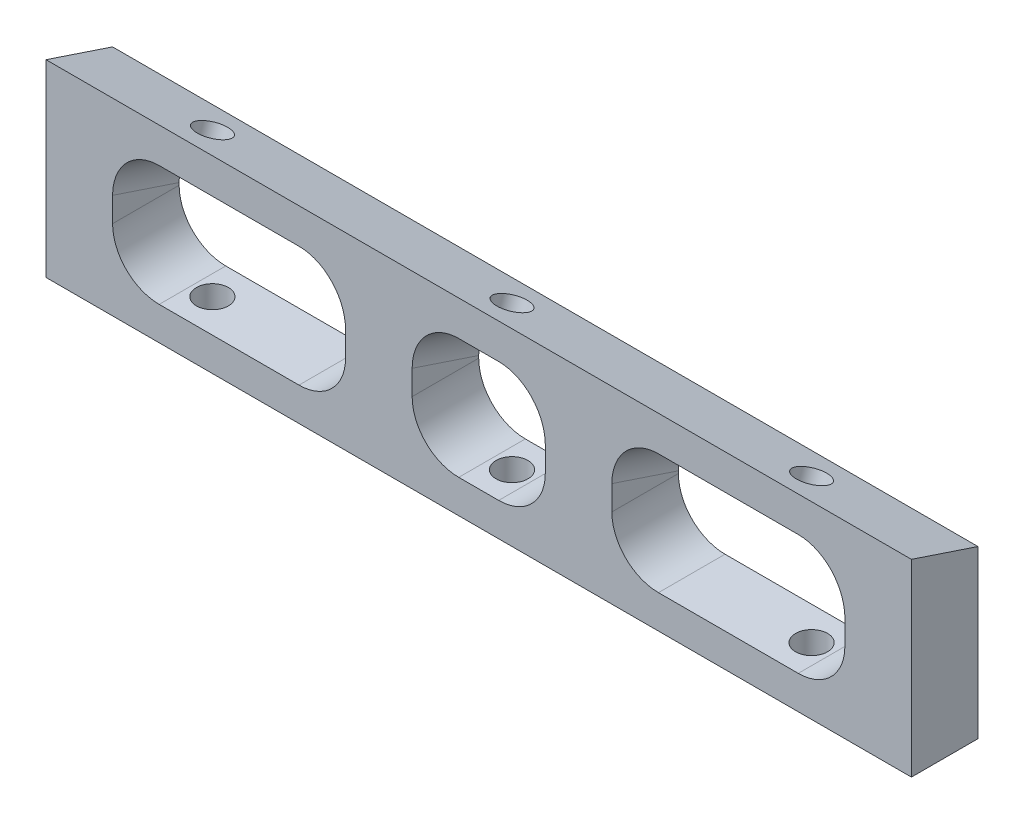
ISO-10303-21;
HEADER;
FILE_DESCRIPTION(('STEP AP214'),'2;1');
FILE_NAME('part.step','',(''),(''),'','','');
FILE_SCHEMA(('AUTOMOTIVE_DESIGN { 1 0 10303 214 1 1 1 1 }'));
ENDSEC;
DATA;
#1=APPLICATION_CONTEXT('core data for automotive mechanical design processes');
#2=APPLICATION_PROTOCOL_DEFINITION('international standard','automotive_design',2000,#1);
#3=PRODUCT_CONTEXT('',#1,'mechanical');
#4=PRODUCT('Part','Part','',(#3));
#5=PRODUCT_RELATED_PRODUCT_CATEGORY('part','',(#4));
#6=PRODUCT_DEFINITION_FORMATION('','',#4);
#7=PRODUCT_DEFINITION_CONTEXT('part definition',#1,'design');
#8=PRODUCT_DEFINITION('design','',#6,#7);
#9=PRODUCT_DEFINITION_SHAPE('','',#8);
#10=(LENGTH_UNIT() NAMED_UNIT(*) SI_UNIT(.MILLI.,.METRE.));
#11=(NAMED_UNIT(*) PLANE_ANGLE_UNIT() SI_UNIT($,.RADIAN.));
#12=(NAMED_UNIT(*) SI_UNIT($,.STERADIAN.) SOLID_ANGLE_UNIT());
#13=UNCERTAINTY_MEASURE_WITH_UNIT(LENGTH_MEASURE(1.E-05),#10,'distance_accuracy_value','');
#14=(GEOMETRIC_REPRESENTATION_CONTEXT(3) GLOBAL_UNCERTAINTY_ASSIGNED_CONTEXT((#13)) GLOBAL_UNIT_ASSIGNED_CONTEXT((#10,
#11,#12)) REPRESENTATION_CONTEXT('',''));
#15=CARTESIAN_POINT('',(0.,0.,0.));
#16=DIRECTION('',(0.,0.,1.));
#17=DIRECTION('',(1.,0.,0.));
#18=AXIS2_PLACEMENT_3D('',#15,#16,#17);
#19=CARTESIAN_POINT('',(110.,-1.74424407145593,0.581247299708271));
#20=DIRECTION('',(0.,0.948710608132916,-0.316145823973799));
#21=DIRECTION('',(0.,0.316145823973799,0.948710608132916));
#22=AXIS2_PLACEMENT_3D('',#19,#20,#21);
#23=PLANE('',#22);
#24=CARTESIAN_POINT('',(100.,-3.07736621159569,-3.419270880131));
#25=DIRECTION('',(0.,0.948710608132916,-0.316145823973799));
#26=DIRECTION('',(0.,0.316145823973799,0.948710608132916));
#27=AXIS2_PLACEMENT_3D('',#24,#25,#26);
#28=CIRCLE('',#27,2.4);
#29=CARTESIAN_POINT('',(100.,-2.31861623405858,-1.142365420612));
#30=VERTEX_POINT('',#29);
#31=EDGE_CURVE('E331',#30,#30,#28,.T.);
#32=ORIENTED_EDGE('',*,*,#31,.T.);
#33=EDGE_LOOP('',(#32));
#34=FACE_BOUND('',#33,.T.);
#35=DIRECTION('',(-1.,0.,0.));
#36=VECTOR('',#35,1.);
#37=CARTESIAN_POINT('',(110.,-1.93793739049709,0.));
#38=LINE('',#37,#36);
#39=CARTESIAN_POINT('',(103.,-1.93793739049709,0.));
#40=VERTEX_POINT('',#39);
#41=CARTESIAN_POINT('',(82.,-1.93793739049709,0.));
#42=VERTEX_POINT('',#41);
#43=EDGE_CURVE('E318',#40,#42,#38,.T.);
#44=ORIENTED_EDGE('',*,*,#43,.T.);
#45=DIRECTION('',(0.,-0.316145823973799,-0.948710608132916));
#46=VECTOR('',#45,1.);
#47=CARTESIAN_POINT('',(82.,-1.74424407145593,0.581247299708276));
#48=LINE('',#47,#46);
#49=CARTESIAN_POINT('',(82.,-5.27031104863485,-10.));
#50=VERTEX_POINT('',#49);
#51=EDGE_CURVE('E418',#42,#50,#48,.T.);
#52=ORIENTED_EDGE('',*,*,#51,.T.);
#53=DIRECTION('',(-1.,0.,0.));
#54=VECTOR('',#53,1.);
#55=CARTESIAN_POINT('',(110.,-5.27031104863485,-10.));
#56=LINE('',#55,#54);
#57=CARTESIAN_POINT('',(103.,-5.27031104863485,-10.));
#58=VERTEX_POINT('',#57);
#59=EDGE_CURVE('E313',#58,#50,#56,.T.);
#60=ORIENTED_EDGE('',*,*,#59,.F.);
#61=DIRECTION('',(0.,-0.316145823973799,-0.948710608132916));
#62=VECTOR('',#61,1.);
#63=CARTESIAN_POINT('',(103.,-1.93793739049709,0.));
#64=LINE('',#63,#62);
#65=EDGE_CURVE('E415',#58,#40,#64,.F.);
#66=ORIENTED_EDGE('',*,*,#65,.T.);
#67=EDGE_LOOP('',(#44,#52,#60,#66));
#68=FACE_BOUND('',#67,.T.);
#69=ADVANCED_FACE('F45',(#34,#68),#23,.F.);
#70=CARTESIAN_POINT('',(110.,-20.,0.));
#71=DIRECTION('',(0.,1.,0.));
#72=DIRECTION('',(0.,0.,1.));
#73=AXIS2_PLACEMENT_3D('',#70,#71,#72);
#74=PLANE('',#73);
#75=CARTESIAN_POINT('',(100.,-20.,-5.00000000000002));
#76=DIRECTION('',(0.,1.,0.));
#77=DIRECTION('',(0.,0.,1.));
#78=AXIS2_PLACEMENT_3D('',#75,#76,#77);
#79=CIRCLE('',#78,2.4);
#80=CARTESIAN_POINT('',(100.,-20.,-2.60000000000002));
#81=VERTEX_POINT('',#80);
#82=EDGE_CURVE('E337',#81,#81,#79,.T.);
#83=ORIENTED_EDGE('',*,*,#82,.F.);
#84=EDGE_LOOP('',(#83));
#85=FACE_BOUND('',#84,.T.);
#86=DIRECTION('',(-1.,0.,0.));
#87=VECTOR('',#86,1.);
#88=CARTESIAN_POINT('',(110.,-20.,-10.));
#89=LINE('',#88,#87);
#90=CARTESIAN_POINT('',(103.,-20.,-10.));
#91=VERTEX_POINT('',#90);
#92=CARTESIAN_POINT('',(82.,-20.,-10.));
#93=VERTEX_POINT('',#92);
#94=EDGE_CURVE('E276',#91,#93,#89,.T.);
#95=ORIENTED_EDGE('',*,*,#94,.T.);
#96=DIRECTION('',(0.,0.,-1.));
#97=VECTOR('',#96,1.);
#98=CARTESIAN_POINT('',(82.,-20.,0.));
#99=LINE('',#98,#97);
#100=CARTESIAN_POINT('',(82.,-20.,0.));
#101=VERTEX_POINT('',#100);
#102=EDGE_CURVE('E405',#93,#101,#99,.F.);
#103=ORIENTED_EDGE('',*,*,#102,.T.);
#104=DIRECTION('',(-1.,0.,0.));
#105=VECTOR('',#104,1.);
#106=CARTESIAN_POINT('',(110.,-20.,0.));
#107=LINE('',#106,#105);
#108=CARTESIAN_POINT('',(103.,-20.,0.));
#109=VERTEX_POINT('',#108);
#110=EDGE_CURVE('E282',#109,#101,#107,.T.);
#111=ORIENTED_EDGE('',*,*,#110,.F.);
#112=DIRECTION('',(0.,0.,-1.));
#113=VECTOR('',#112,1.);
#114=CARTESIAN_POINT('',(103.,-20.,0.));
#115=LINE('',#114,#113);
#116=EDGE_CURVE('E401',#109,#91,#115,.T.);
#117=ORIENTED_EDGE('',*,*,#116,.T.);
#118=EDGE_LOOP('',(#95,#103,#111,#117));
#119=FACE_BOUND('',#118,.T.);
#120=ADVANCED_FACE('F571',(#85,#119),#74,.T.);
#121=CARTESIAN_POINT('',(55.,-3.07736621159569,-3.419270880131));
#122=DIRECTION('',(0.,0.948710608132916,-0.316145823973799));
#123=DIRECTION('',(0.,0.316145823973799,0.948710608132916));
#124=AXIS2_PLACEMENT_3D('',#121,#122,#123);
#125=CIRCLE('',#124,2.4);
#126=CARTESIAN_POINT('',(55.,-2.31861623405858,-1.142365420612));
#127=VERTEX_POINT('',#126);
#128=EDGE_CURVE('E686',#127,#127,#125,.T.);
#129=ORIENTED_EDGE('',*,*,#128,.T.);
#130=EDGE_LOOP('',(#129));
#131=FACE_BOUND('',#130,.T.);
#132=CARTESIAN_POINT('',(58.,-1.93793739049709,0.));
#133=VERTEX_POINT('',#132);
#134=CARTESIAN_POINT('',(52.,-1.93793739049709,0.));
#135=VERTEX_POINT('',#134);
#136=EDGE_CURVE('E323',#133,#135,#38,.T.);
#137=ORIENTED_EDGE('',*,*,#136,.T.);
#138=DIRECTION('',(0.,-0.316145823973799,-0.948710608132916));
#139=VECTOR('',#138,1.);
#140=CARTESIAN_POINT('',(52.,-1.74424407145593,0.581247299708271));
#141=LINE('',#140,#139);
#142=CARTESIAN_POINT('',(52.,-5.27031104863485,-10.));
#143=VERTEX_POINT('',#142);
#144=EDGE_CURVE('E390',#135,#143,#141,.T.);
#145=ORIENTED_EDGE('',*,*,#144,.T.);
#146=CARTESIAN_POINT('',(58.,-5.27031104863485,-10.));
#147=VERTEX_POINT('',#146);
#148=EDGE_CURVE('E317',#147,#143,#56,.T.);
#149=ORIENTED_EDGE('',*,*,#148,.F.);
#150=DIRECTION('',(0.,0.316145823973799,0.948710608132916));
#151=VECTOR('',#150,1.);
#152=CARTESIAN_POINT('',(58.,-1.74424407145593,0.581247299708271));
#153=LINE('',#152,#151);
#154=EDGE_CURVE('E386',#147,#133,#153,.T.);
#155=ORIENTED_EDGE('',*,*,#154,.T.);
#156=EDGE_LOOP('',(#137,#145,#149,#155));
#157=FACE_BOUND('',#156,.T.);
#158=ADVANCED_FACE('F574',(#131,#157),#23,.F.);
#159=CARTESIAN_POINT('',(55.,-20.,-5.00000000000002));
#160=DIRECTION('',(0.,1.,0.));
#161=DIRECTION('',(0.,0.,1.));
#162=AXIS2_PLACEMENT_3D('',#159,#160,#161);
#163=CIRCLE('',#162,2.4);
#164=CARTESIAN_POINT('',(55.,-20.,-2.60000000000002));
#165=VERTEX_POINT('',#164);
#166=EDGE_CURVE('E670',#165,#165,#163,.T.);
#167=ORIENTED_EDGE('',*,*,#166,.F.);
#168=EDGE_LOOP('',(#167));
#169=FACE_BOUND('',#168,.T.);
#170=CARTESIAN_POINT('',(58.,-20.,-10.));
#171=VERTEX_POINT('',#170);
#172=CARTESIAN_POINT('',(52.,-20.,-10.));
#173=VERTEX_POINT('',#172);
#174=EDGE_CURVE('E281',#171,#173,#89,.T.);
#175=ORIENTED_EDGE('',*,*,#174,.T.);
#176=DIRECTION('',(0.,0.,-1.));
#177=VECTOR('',#176,1.);
#178=CARTESIAN_POINT('',(52.,-20.,0.));
#179=LINE('',#178,#177);
#180=CARTESIAN_POINT('',(52.,-20.,0.));
#181=VERTEX_POINT('',#180);
#182=EDGE_CURVE('E348',#173,#181,#179,.F.);
#183=ORIENTED_EDGE('',*,*,#182,.T.);
#184=CARTESIAN_POINT('',(58.,-20.,0.));
#185=VERTEX_POINT('',#184);
#186=EDGE_CURVE('E287',#185,#181,#107,.T.);
#187=ORIENTED_EDGE('',*,*,#186,.F.);
#188=DIRECTION('',(0.,0.,1.));
#189=VECTOR('',#188,1.);
#190=CARTESIAN_POINT('',(58.,-20.,-10.));
#191=LINE('',#190,#189);
#192=EDGE_CURVE('E345',#185,#171,#191,.F.);
#193=ORIENTED_EDGE('',*,*,#192,.T.);
#194=EDGE_LOOP('',(#175,#183,#187,#193));
#195=FACE_BOUND('',#194,.T.);
#196=ADVANCED_FACE('F580',(#169,#195),#74,.T.);
#197=CARTESIAN_POINT('',(110.,2.99930896920865,-0.999481820160727));
#198=DIRECTION('',(0.,-0.948710608132916,0.3161458239738));
#199=DIRECTION('',(0.,-0.3161458239738,-0.948710608132916));
#200=AXIS2_PLACEMENT_3D('',#197,#198,#199);
#201=PLANE('',#200);
#202=CARTESIAN_POINT('',(10.,1.66618682906889,-5.));
#203=DIRECTION('',(0.,0.948710608132916,-0.3161458239738));
#204=DIRECTION('',(0.,0.3161458239738,0.948710608132916));
#205=AXIS2_PLACEMENT_3D('',#202,#203,#204);
#206=CIRCLE('',#205,2.4);
#207=CARTESIAN_POINT('',(10.,2.42493680660601,-2.723094540481));
#208=VERTEX_POINT('',#207);
#209=EDGE_CURVE('E332',#208,#208,#206,.T.);
#210=ORIENTED_EDGE('',*,*,#209,.F.);
#211=EDGE_LOOP('',(#210));
#212=FACE_BOUND('',#211,.T.);
#213=CARTESIAN_POINT('',(55.,1.66618682906889,-5.));
#214=DIRECTION('',(0.,0.948710608132916,-0.3161458239738));
#215=DIRECTION('',(0.,0.3161458239738,0.948710608132916));
#216=AXIS2_PLACEMENT_3D('',#213,#214,#215);
#217=CIRCLE('',#216,2.4);
#218=CARTESIAN_POINT('',(55.,2.42493680660601,-2.723094540481));
#219=VERTEX_POINT('',#218);
#220=EDGE_CURVE('E677',#219,#219,#217,.T.);
#221=ORIENTED_EDGE('',*,*,#220,.F.);
#222=EDGE_LOOP('',(#221));
#223=FACE_BOUND('',#222,.T.);
#224=CARTESIAN_POINT('',(100.,1.66618682906889,-5.));
#225=DIRECTION('',(0.,0.948710608132916,-0.3161458239738));
#226=DIRECTION('',(0.,0.3161458239738,0.948710608132916));
#227=AXIS2_PLACEMENT_3D('',#224,#225,#226);
#228=CIRCLE('',#227,2.4);
#229=CARTESIAN_POINT('',(100.,2.42493680660601,-2.723094540481));
#230=VERTEX_POINT('',#229);
#231=EDGE_CURVE('E674',#230,#230,#228,.T.);
#232=ORIENTED_EDGE('',*,*,#231,.F.);
#233=EDGE_LOOP('',(#232));
#234=FACE_BOUND('',#233,.T.);
#235=DIRECTION('',(-1.,0.,0.));
#236=VECTOR('',#235,1.);
#237=CARTESIAN_POINT('',(110.,0.,-10.));
#238=LINE('',#237,#236);
#239=CARTESIAN_POINT('',(120.,0.,-10.));
#240=VERTEX_POINT('',#239);
#241=CARTESIAN_POINT('',(-10.,0.,-10.));
#242=VERTEX_POINT('',#241);
#243=EDGE_CURVE('E309',#240,#242,#238,.T.);
#244=ORIENTED_EDGE('',*,*,#243,.T.);
#245=DIRECTION('',(0.,-0.3161458239738,-0.948710608132916));
#246=VECTOR('',#245,1.);
#247=CARTESIAN_POINT('',(-10.,2.99930896920865,-0.999481820160727));
#248=LINE('',#247,#246);
#249=CARTESIAN_POINT('',(-10.,3.33237365813777,0.));
#250=VERTEX_POINT('',#249);
#251=EDGE_CURVE('E288',#250,#242,#248,.T.);
#252=ORIENTED_EDGE('',*,*,#251,.F.);
#253=DIRECTION('',(-1.,0.,0.));
#254=VECTOR('',#253,1.);
#255=CARTESIAN_POINT('',(110.,3.33237365813777,0.));
#256=LINE('',#255,#254);
#257=CARTESIAN_POINT('',(120.,3.33237365813777,0.));
#258=VERTEX_POINT('',#257);
#259=EDGE_CURVE('E322',#258,#250,#256,.T.);
#260=ORIENTED_EDGE('',*,*,#259,.F.);
#261=DIRECTION('',(0.,0.3161458239738,0.948710608132916));
#262=VECTOR('',#261,1.);
#263=CARTESIAN_POINT('',(120.,2.99930896920865,-0.999481820160727));
#264=LINE('',#263,#262);
#265=EDGE_CURVE('E252',#240,#258,#264,.T.);
#266=ORIENTED_EDGE('',*,*,#265,.F.);
#267=EDGE_LOOP('',(#244,#252,#260,#266));
#268=FACE_BOUND('',#267,.T.);
#269=ADVANCED_FACE('F594',(#212,#223,#234,#268),#201,.F.);
#270=CARTESIAN_POINT('',(110.,0.,0.));
#271=DIRECTION('',(0.,0.,-1.));
#272=DIRECTION('',(0.,1.,0.));
#273=AXIS2_PLACEMENT_3D('',#270,#271,#272);
#274=PLANE('',#273);
#275=ORIENTED_EDGE('',*,*,#136,.F.);
#276=CARTESIAN_POINT('',(58.,-9.31637285858588,0.));
#277=DIRECTION('',(0.,0.,-1.));
#278=DIRECTION('',(0.,1.,0.));
#279=AXIS2_PLACEMENT_3D('',#276,#277,#278);
#280=ELLIPSE('',#279,7.37843546808879,7.);
#281=CARTESIAN_POINT('',(65.,-9.31637285858588,0.));
#282=VERTEX_POINT('',#281);
#283=EDGE_CURVE('E463',#133,#282,#280,.T.);
#284=ORIENTED_EDGE('',*,*,#283,.T.);
#285=DIRECTION('',(0.,1.,0.));
#286=VECTOR('',#285,1.);
#287=CARTESIAN_POINT('',(65.,0.,0.));
#288=LINE('',#287,#286);
#289=CARTESIAN_POINT('',(65.,-13.,0.));
#290=VERTEX_POINT('',#289);
#291=EDGE_CURVE('E690',#290,#282,#288,.T.);
#292=ORIENTED_EDGE('',*,*,#291,.F.);
#293=CARTESIAN_POINT('',(58.,-13.,0.));
#294=DIRECTION('',(0.,0.,-1.));
#295=DIRECTION('',(0.,1.,0.));
#296=AXIS2_PLACEMENT_3D('',#293,#294,#295);
#297=CIRCLE('',#296,7.);
#298=EDGE_CURVE('E433',#290,#185,#297,.T.);
#299=ORIENTED_EDGE('',*,*,#298,.T.);
#300=ORIENTED_EDGE('',*,*,#186,.T.);
#301=CARTESIAN_POINT('',(52.,-13.,0.));
#302=DIRECTION('',(0.,0.,-1.));
#303=DIRECTION('',(0.,1.,0.));
#304=AXIS2_PLACEMENT_3D('',#301,#302,#303);
#305=CIRCLE('',#304,7.);
#306=CARTESIAN_POINT('',(45.,-13.,0.));
#307=VERTEX_POINT('',#306);
#308=EDGE_CURVE('E424',#181,#307,#305,.T.);
#309=ORIENTED_EDGE('',*,*,#308,.T.);
#310=DIRECTION('',(0.,-1.,0.));
#311=VECTOR('',#310,1.);
#312=CARTESIAN_POINT('',(45.,0.,0.));
#313=LINE('',#312,#311);
#314=CARTESIAN_POINT('',(45.,-9.31637285858588,0.));
#315=VERTEX_POINT('',#314);
#316=EDGE_CURVE('E540',#315,#307,#313,.T.);
#317=ORIENTED_EDGE('',*,*,#316,.F.);
#318=CARTESIAN_POINT('',(52.,-9.31637285858588,0.));
#319=DIRECTION('',(0.,0.,-1.));
#320=DIRECTION('',(0.,-1.,0.));
#321=AXIS2_PLACEMENT_3D('',#318,#319,#320);
#322=ELLIPSE('',#321,7.37843546808879,7.);
#323=EDGE_CURVE('E460',#315,#135,#322,.T.);
#324=ORIENTED_EDGE('',*,*,#323,.T.);
#325=EDGE_LOOP('',(#275,#284,#292,#299,#300,#309,#317,#324));
#326=FACE_BOUND('',#325,.T.);
#327=DIRECTION('',(0.,-1.,0.));
#328=VECTOR('',#327,1.);
#329=CARTESIAN_POINT('',(75.,0.,0.));
#330=LINE('',#329,#328);
#331=CARTESIAN_POINT('',(75.,-9.31637285858588,0.));
#332=VERTEX_POINT('',#331);
#333=CARTESIAN_POINT('',(75.,-13.,0.));
#334=VERTEX_POINT('',#333);
#335=EDGE_CURVE('E695',#332,#334,#330,.T.);
#336=ORIENTED_EDGE('',*,*,#335,.F.);
#337=CARTESIAN_POINT('',(82.,-9.31637285858588,0.));
#338=DIRECTION('',(0.,0.,-1.));
#339=DIRECTION('',(0.,-1.,0.));
#340=AXIS2_PLACEMENT_3D('',#337,#338,#339);
#341=ELLIPSE('',#340,7.37843546808879,7.);
#342=EDGE_CURVE('E483',#332,#42,#341,.T.);
#343=ORIENTED_EDGE('',*,*,#342,.T.);
#344=ORIENTED_EDGE('',*,*,#43,.F.);
#345=CARTESIAN_POINT('',(103.,-9.31637285858588,0.));
#346=DIRECTION('',(0.,0.,-1.));
#347=DIRECTION('',(0.,1.,0.));
#348=AXIS2_PLACEMENT_3D('',#345,#346,#347);
#349=ELLIPSE('',#348,7.37843546808879,7.);
#350=CARTESIAN_POINT('',(110.,-9.31637285858588,0.));
#351=VERTEX_POINT('',#350);
#352=EDGE_CURVE('E11',#40,#351,#349,.T.);
#353=ORIENTED_EDGE('',*,*,#352,.T.);
#354=DIRECTION('',(0.,-1.,0.));
#355=VECTOR('',#354,1.);
#356=CARTESIAN_POINT('',(110.,0.,0.));
#357=LINE('',#356,#355);
#358=CARTESIAN_POINT('',(110.,-13.,0.));
#359=VERTEX_POINT('',#358);
#360=EDGE_CURVE('E269',#351,#359,#357,.T.);
#361=ORIENTED_EDGE('',*,*,#360,.T.);
#362=CARTESIAN_POINT('',(103.,-13.,0.));
#363=DIRECTION('',(0.,0.,-1.));
#364=DIRECTION('',(0.,1.,0.));
#365=AXIS2_PLACEMENT_3D('',#362,#363,#364);
#366=CIRCLE('',#365,7.);
#367=EDGE_CURVE('E478',#359,#109,#366,.T.);
#368=ORIENTED_EDGE('',*,*,#367,.T.);
#369=ORIENTED_EDGE('',*,*,#110,.T.);
#370=CARTESIAN_POINT('',(82.,-13.,0.));
#371=DIRECTION('',(0.,0.,-1.));
#372=DIRECTION('',(0.,1.,0.));
#373=AXIS2_PLACEMENT_3D('',#370,#371,#372);
#374=CIRCLE('',#373,7.);
#375=EDGE_CURVE('E472',#101,#334,#374,.T.);
#376=ORIENTED_EDGE('',*,*,#375,.T.);
#377=EDGE_LOOP('',(#336,#343,#344,#353,#361,#368,#369,#376));
#378=FACE_BOUND('',#377,.T.);
#379=DIRECTION('',(1.,0.,0.));
#380=VECTOR('',#379,1.);
#381=CARTESIAN_POINT('',(-10.,-25.,0.));
#382=LINE('',#381,#380);
#383=CARTESIAN_POINT('',(-10.,-25.,0.));
#384=VERTEX_POINT('',#383);
#385=CARTESIAN_POINT('',(120.,-25.,0.));
#386=VERTEX_POINT('',#385);
#387=EDGE_CURVE('E232',#384,#386,#382,.T.);
#388=ORIENTED_EDGE('',*,*,#387,.T.);
#389=DIRECTION('',(0.,-1.,0.));
#390=VECTOR('',#389,1.);
#391=CARTESIAN_POINT('',(120.,0.,0.));
#392=LINE('',#391,#390);
#393=EDGE_CURVE('E236',#258,#386,#392,.T.);
#394=ORIENTED_EDGE('',*,*,#393,.F.);
#395=ORIENTED_EDGE('',*,*,#259,.T.);
#396=DIRECTION('',(0.,1.,0.));
#397=VECTOR('',#396,1.);
#398=CARTESIAN_POINT('',(-10.,0.,0.));
#399=LINE('',#398,#397);
#400=EDGE_CURVE('E238',#384,#250,#399,.T.);
#401=ORIENTED_EDGE('',*,*,#400,.F.);
#402=EDGE_LOOP('',(#388,#394,#395,#401));
#403=FACE_BOUND('',#402,.T.);
#404=DIRECTION('',(0.,1.,0.));
#405=VECTOR('',#404,1.);
#406=CARTESIAN_POINT('',(35.,0.,0.));
#407=LINE('',#406,#405);
#408=CARTESIAN_POINT('',(35.,-13.,0.));
#409=VERTEX_POINT('',#408);
#410=CARTESIAN_POINT('',(35.,-9.31637285858589,0.));
#411=VERTEX_POINT('',#410);
#412=EDGE_CURVE('E273',#409,#411,#407,.T.);
#413=ORIENTED_EDGE('',*,*,#412,.F.);
#414=CARTESIAN_POINT('',(28.,-13.,0.));
#415=DIRECTION('',(0.,0.,-1.));
#416=DIRECTION('',(0.,1.,0.));
#417=AXIS2_PLACEMENT_3D('',#414,#415,#416);
#418=CIRCLE('',#417,7.);
#419=CARTESIAN_POINT('',(28.,-20.,0.));
#420=VERTEX_POINT('',#419);
#421=EDGE_CURVE('E427',#409,#420,#418,.T.);
#422=ORIENTED_EDGE('',*,*,#421,.T.);
#423=CARTESIAN_POINT('',(7.00000000000001,-20.,0.));
#424=VERTEX_POINT('',#423);
#425=EDGE_CURVE('E280',#420,#424,#107,.T.);
#426=ORIENTED_EDGE('',*,*,#425,.T.);
#427=CARTESIAN_POINT('',(7.,-13.,0.));
#428=DIRECTION('',(0.,0.,-1.));
#429=DIRECTION('',(0.,1.,0.));
#430=AXIS2_PLACEMENT_3D('',#427,#428,#429);
#431=CIRCLE('',#430,7.);
#432=CARTESIAN_POINT('',(0.,-13.,0.));
#433=VERTEX_POINT('',#432);
#434=EDGE_CURVE('E448',#424,#433,#431,.T.);
#435=ORIENTED_EDGE('',*,*,#434,.T.);
#436=DIRECTION('',(0.,1.,0.));
#437=VECTOR('',#436,1.);
#438=CARTESIAN_POINT('',(0.,0.,0.));
#439=LINE('',#438,#437);
#440=CARTESIAN_POINT('',(0.,-9.31637285858588,0.));
#441=VERTEX_POINT('',#440);
#442=EDGE_CURVE('E293',#433,#441,#439,.T.);
#443=ORIENTED_EDGE('',*,*,#442,.T.);
#444=CARTESIAN_POINT('',(7.00000000000001,-9.31637285858588,0.));
#445=DIRECTION('',(0.,0.,-1.));
#446=DIRECTION('',(0.,1.,0.));
#447=AXIS2_PLACEMENT_3D('',#444,#445,#446);
#448=ELLIPSE('',#447,7.37843546808879,7.);
#449=CARTESIAN_POINT('',(7.00000000000001,-1.93793739049709,0.));
#450=VERTEX_POINT('',#449);
#451=EDGE_CURVE('E454',#441,#450,#448,.T.);
#452=ORIENTED_EDGE('',*,*,#451,.T.);
#453=CARTESIAN_POINT('',(28.,-1.93793739049709,0.));
#454=VERTEX_POINT('',#453);
#455=EDGE_CURVE('E316',#454,#450,#38,.T.);
#456=ORIENTED_EDGE('',*,*,#455,.F.);
#457=CARTESIAN_POINT('',(28.,-9.31637285858588,0.));
#458=DIRECTION('',(0.,0.,-1.));
#459=DIRECTION('',(0.,1.,0.));
#460=AXIS2_PLACEMENT_3D('',#457,#458,#459);
#461=ELLIPSE('',#460,7.37843546808879,7.);
#462=EDGE_CURVE('E439',#454,#411,#461,.T.);
#463=ORIENTED_EDGE('',*,*,#462,.T.);
#464=EDGE_LOOP('',(#413,#422,#426,#435,#443,#452,#456,#463));
#465=FACE_BOUND('',#464,.T.);
#466=ADVANCED_FACE('F234',(#326,#378,#403,#465),#274,.F.);
#467=CARTESIAN_POINT('',(10.,-3.07736621159569,-3.419270880131));
#468=DIRECTION('',(0.,0.948710608132916,-0.316145823973799));
#469=DIRECTION('',(0.,0.316145823973799,0.948710608132916));
#470=AXIS2_PLACEMENT_3D('',#467,#468,#469);
#471=CIRCLE('',#470,2.4);
#472=CARTESIAN_POINT('',(10.,-2.31861623405858,-1.142365420612));
#473=VERTEX_POINT('',#472);
#474=EDGE_CURVE('E327',#473,#473,#471,.T.);
#475=ORIENTED_EDGE('',*,*,#474,.T.);
#476=EDGE_LOOP('',(#475));
#477=FACE_BOUND('',#476,.T.);
#478=CARTESIAN_POINT('',(28.,-5.27031104863485,-10.));
#479=VERTEX_POINT('',#478);
#480=CARTESIAN_POINT('',(7.00000000000001,-5.27031104863485,-10.));
#481=VERTEX_POINT('',#480);
#482=EDGE_CURVE('E312',#479,#481,#56,.T.);
#483=ORIENTED_EDGE('',*,*,#482,.F.);
#484=DIRECTION('',(0.,0.316145823973799,0.948710608132916));
#485=VECTOR('',#484,1.);
#486=CARTESIAN_POINT('',(28.,-1.74424407145593,0.581247299708278));
#487=LINE('',#486,#485);
#488=EDGE_CURVE('E375',#479,#454,#487,.T.);
#489=ORIENTED_EDGE('',*,*,#488,.T.);
#490=ORIENTED_EDGE('',*,*,#455,.T.);
#491=DIRECTION('',(0.,-0.316145823973799,-0.948710608132916));
#492=VECTOR('',#491,1.);
#493=CARTESIAN_POINT('',(7.00000000000001,-5.27031104863485,-10.));
#494=LINE('',#493,#492);
#495=EDGE_CURVE('E371',#450,#481,#494,.T.);
#496=ORIENTED_EDGE('',*,*,#495,.T.);
#497=EDGE_LOOP('',(#483,#489,#490,#496));
#498=FACE_BOUND('',#497,.T.);
#499=ADVANCED_FACE('F527',(#477,#498),#23,.F.);
#500=CARTESIAN_POINT('',(110.,0.,-10.));
#501=DIRECTION('',(0.,0.,1.));
#502=DIRECTION('',(0.,-1.,0.));
#503=AXIS2_PLACEMENT_3D('',#500,#501,#502);
#504=PLANE('',#503);
#505=ORIENTED_EDGE('',*,*,#174,.F.);
#506=CARTESIAN_POINT('',(58.,-13.,-10.));
#507=DIRECTION('',(0.,0.,1.));
#508=DIRECTION('',(0.,-1.,0.));
#509=AXIS2_PLACEMENT_3D('',#506,#507,#508);
#510=CIRCLE('',#509,7.);
#511=CARTESIAN_POINT('',(65.,-13.,-10.));
#512=VERTEX_POINT('',#511);
#513=EDGE_CURVE('E436',#171,#512,#510,.T.);
#514=ORIENTED_EDGE('',*,*,#513,.T.);
#515=DIRECTION('',(0.,1.,0.));
#516=VECTOR('',#515,1.);
#517=CARTESIAN_POINT('',(65.,0.,-10.));
#518=LINE('',#517,#516);
#519=CARTESIAN_POINT('',(65.,-12.6487465167236,-10.));
#520=VERTEX_POINT('',#519);
#521=EDGE_CURVE('E691',#512,#520,#518,.T.);
#522=ORIENTED_EDGE('',*,*,#521,.T.);
#523=CARTESIAN_POINT('',(58.,-12.6487465167237,-10.));
#524=DIRECTION('',(0.,0.,1.));
#525=DIRECTION('',(0.,1.,0.));
#526=AXIS2_PLACEMENT_3D('',#523,#524,#525);
#527=ELLIPSE('',#526,7.3784354680888,7.);
#528=EDGE_CURVE('E466',#520,#147,#527,.T.);
#529=ORIENTED_EDGE('',*,*,#528,.T.);
#530=ORIENTED_EDGE('',*,*,#148,.T.);
#531=CARTESIAN_POINT('',(52.,-12.6487465167237,-10.));
#532=DIRECTION('',(0.,0.,1.));
#533=DIRECTION('',(0.,-1.,0.));
#534=AXIS2_PLACEMENT_3D('',#531,#532,#533);
#535=ELLIPSE('',#534,7.3784354680888,7.);
#536=CARTESIAN_POINT('',(45.,-12.6487465167237,-10.));
#537=VERTEX_POINT('',#536);
#538=EDGE_CURVE('E457',#143,#537,#535,.T.);
#539=ORIENTED_EDGE('',*,*,#538,.T.);
#540=DIRECTION('',(0.,-1.,0.));
#541=VECTOR('',#540,1.);
#542=CARTESIAN_POINT('',(45.,0.,-10.));
#543=LINE('',#542,#541);
#544=CARTESIAN_POINT('',(45.,-13.,-10.));
#545=VERTEX_POINT('',#544);
#546=EDGE_CURVE('E548',#537,#545,#543,.T.);
#547=ORIENTED_EDGE('',*,*,#546,.T.);
#548=CARTESIAN_POINT('',(52.,-13.,-10.));
#549=DIRECTION('',(0.,0.,1.));
#550=DIRECTION('',(0.,-1.,0.));
#551=AXIS2_PLACEMENT_3D('',#548,#549,#550);
#552=CIRCLE('',#551,7.);
#553=EDGE_CURVE('E421',#545,#173,#552,.T.);
#554=ORIENTED_EDGE('',*,*,#553,.T.);
#555=EDGE_LOOP('',(#505,#514,#522,#529,#530,#539,#547,#554));
#556=FACE_BOUND('',#555,.T.);
#557=DIRECTION('',(0.,1.,0.));
#558=VECTOR('',#557,1.);
#559=CARTESIAN_POINT('',(110.,0.,-10.));
#560=LINE('',#559,#558);
#561=CARTESIAN_POINT('',(110.,-13.,-10.));
#562=VERTEX_POINT('',#561);
#563=CARTESIAN_POINT('',(110.,-12.6487465167237,-10.));
#564=VERTEX_POINT('',#563);
#565=EDGE_CURVE('E254',#562,#564,#560,.T.);
#566=ORIENTED_EDGE('',*,*,#565,.T.);
#567=CARTESIAN_POINT('',(103.,-12.6487465167237,-10.));
#568=DIRECTION('',(0.,0.,1.));
#569=DIRECTION('',(0.,1.,0.));
#570=AXIS2_PLACEMENT_3D('',#567,#568,#569);
#571=ELLIPSE('',#570,7.3784354680888,7.);
#572=EDGE_CURVE('E54',#564,#58,#571,.T.);
#573=ORIENTED_EDGE('',*,*,#572,.T.);
#574=ORIENTED_EDGE('',*,*,#59,.T.);
#575=CARTESIAN_POINT('',(82.,-12.6487465167237,-10.));
#576=DIRECTION('',(0.,0.,1.));
#577=DIRECTION('',(0.,-1.,0.));
#578=AXIS2_PLACEMENT_3D('',#575,#576,#577);
#579=ELLIPSE('',#578,7.3784354680888,7.);
#580=CARTESIAN_POINT('',(75.,-12.6487465167236,-10.));
#581=VERTEX_POINT('',#580);
#582=EDGE_CURVE('E61',#50,#581,#579,.T.);
#583=ORIENTED_EDGE('',*,*,#582,.T.);
#584=DIRECTION('',(0.,-1.,0.));
#585=VECTOR('',#584,1.);
#586=CARTESIAN_POINT('',(75.,0.,-10.));
#587=LINE('',#586,#585);
#588=CARTESIAN_POINT('',(75.,-13.,-10.));
#589=VERTEX_POINT('',#588);
#590=EDGE_CURVE('E551',#581,#589,#587,.T.);
#591=ORIENTED_EDGE('',*,*,#590,.T.);
#592=CARTESIAN_POINT('',(82.,-13.,-10.));
#593=DIRECTION('',(0.,0.,1.));
#594=DIRECTION('',(0.,-1.,0.));
#595=AXIS2_PLACEMENT_3D('',#592,#593,#594);
#596=CIRCLE('',#595,7.);
#597=EDGE_CURVE('E469',#589,#93,#596,.T.);
#598=ORIENTED_EDGE('',*,*,#597,.T.);
#599=ORIENTED_EDGE('',*,*,#94,.F.);
#600=CARTESIAN_POINT('',(103.,-13.,-10.));
#601=DIRECTION('',(0.,0.,1.));
#602=DIRECTION('',(0.,-1.,0.));
#603=AXIS2_PLACEMENT_3D('',#600,#601,#602);
#604=CIRCLE('',#603,7.);
#605=EDGE_CURVE('E475',#91,#562,#604,.T.);
#606=ORIENTED_EDGE('',*,*,#605,.T.);
#607=EDGE_LOOP('',(#566,#573,#574,#583,#591,#598,#599,#606));
#608=FACE_BOUND('',#607,.T.);
#609=CARTESIAN_POINT('',(28.,-20.,-10.));
#610=VERTEX_POINT('',#609);
#611=CARTESIAN_POINT('',(7.00000000000001,-20.,-10.));
#612=VERTEX_POINT('',#611);
#613=EDGE_CURVE('E268',#610,#612,#89,.T.);
#614=ORIENTED_EDGE('',*,*,#613,.F.);
#615=CARTESIAN_POINT('',(28.,-13.,-10.));
#616=DIRECTION('',(0.,0.,1.));
#617=DIRECTION('',(0.,-1.,0.));
#618=AXIS2_PLACEMENT_3D('',#615,#616,#617);
#619=CIRCLE('',#618,7.);
#620=CARTESIAN_POINT('',(35.,-13.,-10.));
#621=VERTEX_POINT('',#620);
#622=EDGE_CURVE('E430',#610,#621,#619,.T.);
#623=ORIENTED_EDGE('',*,*,#622,.T.);
#624=DIRECTION('',(0.,1.,0.));
#625=VECTOR('',#624,1.);
#626=CARTESIAN_POINT('',(35.,0.,-10.));
#627=LINE('',#626,#625);
#628=CARTESIAN_POINT('',(35.,-12.6487465167237,-10.));
#629=VERTEX_POINT('',#628);
#630=EDGE_CURVE('E544',#621,#629,#627,.T.);
#631=ORIENTED_EDGE('',*,*,#630,.T.);
#632=CARTESIAN_POINT('',(28.,-12.6487465167237,-10.));
#633=DIRECTION('',(0.,0.,1.));
#634=DIRECTION('',(0.,1.,0.));
#635=AXIS2_PLACEMENT_3D('',#632,#633,#634);
#636=ELLIPSE('',#635,7.3784354680888,7.);
#637=EDGE_CURVE('E442',#629,#479,#636,.T.);
#638=ORIENTED_EDGE('',*,*,#637,.T.);
#639=ORIENTED_EDGE('',*,*,#482,.T.);
#640=CARTESIAN_POINT('',(7.00000000000001,-12.6487465167237,-10.));
#641=DIRECTION('',(0.,0.,1.));
#642=DIRECTION('',(0.,1.,0.));
#643=AXIS2_PLACEMENT_3D('',#640,#641,#642);
#644=ELLIPSE('',#643,7.3784354680888,7.);
#645=CARTESIAN_POINT('',(0.,-12.6487465167237,-10.));
#646=VERTEX_POINT('',#645);
#647=EDGE_CURVE('E451',#481,#646,#644,.T.);
#648=ORIENTED_EDGE('',*,*,#647,.T.);
#649=DIRECTION('',(0.,-1.,0.));
#650=VECTOR('',#649,1.);
#651=CARTESIAN_POINT('',(0.,0.,-10.));
#652=LINE('',#651,#650);
#653=CARTESIAN_POINT('',(0.,-13.,-10.));
#654=VERTEX_POINT('',#653);
#655=EDGE_CURVE('E286',#646,#654,#652,.T.);
#656=ORIENTED_EDGE('',*,*,#655,.T.);
#657=CARTESIAN_POINT('',(7.,-13.,-10.));
#658=DIRECTION('',(0.,0.,1.));
#659=DIRECTION('',(0.,-1.,0.));
#660=AXIS2_PLACEMENT_3D('',#657,#658,#659);
#661=CIRCLE('',#660,7.);
#662=EDGE_CURVE('E445',#654,#612,#661,.T.);
#663=ORIENTED_EDGE('',*,*,#662,.T.);
#664=EDGE_LOOP('',(#614,#623,#631,#638,#639,#648,#656,#663));
#665=FACE_BOUND('',#664,.T.);
#666=DIRECTION('',(0.,-1.,0.));
#667=VECTOR('',#666,1.);
#668=CARTESIAN_POINT('',(-10.,0.,-10.));
#669=LINE('',#668,#667);
#670=CARTESIAN_POINT('',(-10.,-25.,-10.));
#671=VERTEX_POINT('',#670);
#672=EDGE_CURVE('E292',#242,#671,#669,.T.);
#673=ORIENTED_EDGE('',*,*,#672,.F.);
#674=ORIENTED_EDGE('',*,*,#243,.F.);
#675=DIRECTION('',(0.,1.,0.));
#676=VECTOR('',#675,1.);
#677=CARTESIAN_POINT('',(120.,0.,-10.));
#678=LINE('',#677,#676);
#679=CARTESIAN_POINT('',(120.,-25.,-10.));
#680=VERTEX_POINT('',#679);
#681=EDGE_CURVE('E260',#680,#240,#678,.T.);
#682=ORIENTED_EDGE('',*,*,#681,.F.);
#683=DIRECTION('',(1.,0.,0.));
#684=VECTOR('',#683,1.);
#685=CARTESIAN_POINT('',(-10.,-25.,-10.));
#686=LINE('',#685,#684);
#687=EDGE_CURVE('E243',#671,#680,#686,.T.);
#688=ORIENTED_EDGE('',*,*,#687,.F.);
#689=EDGE_LOOP('',(#673,#674,#682,#688));
#690=FACE_BOUND('',#689,.T.);
#691=ADVANCED_FACE('F553',(#556,#608,#665,#690),#504,.F.);
#692=CARTESIAN_POINT('',(-10.,-25.,0.));
#693=DIRECTION('',(0.,1.,0.));
#694=DIRECTION('',(0.,0.,1.));
#695=AXIS2_PLACEMENT_3D('',#692,#693,#694);
#696=PLANE('',#695);
#697=CARTESIAN_POINT('',(10.,-25.,-5.));
#698=DIRECTION('',(0.,-1.,0.));
#699=DIRECTION('',(0.,0.,-1.));
#700=AXIS2_PLACEMENT_3D('',#697,#698,#699);
#701=CIRCLE('',#700,2.4);
#702=CARTESIAN_POINT('',(10.,-25.,-7.4));
#703=VERTEX_POINT('',#702);
#704=EDGE_CURVE('E338',#703,#703,#701,.T.);
#705=ORIENTED_EDGE('',*,*,#704,.F.);
#706=EDGE_LOOP('',(#705));
#707=FACE_BOUND('',#706,.T.);
#708=CARTESIAN_POINT('',(55.,-25.,-5.00000000000002));
#709=DIRECTION('',(0.,-1.,0.));
#710=DIRECTION('',(0.,0.,-1.));
#711=AXIS2_PLACEMENT_3D('',#708,#709,#710);
#712=CIRCLE('',#711,2.4);
#713=CARTESIAN_POINT('',(55.,-25.,-7.40000000000002));
#714=VERTEX_POINT('',#713);
#715=EDGE_CURVE('E656',#714,#714,#712,.T.);
#716=ORIENTED_EDGE('',*,*,#715,.F.);
#717=EDGE_LOOP('',(#716));
#718=FACE_BOUND('',#717,.T.);
#719=CARTESIAN_POINT('',(100.,-25.,-5.00000000000002));
#720=DIRECTION('',(0.,-1.,0.));
#721=DIRECTION('',(0.,0.,-1.));
#722=AXIS2_PLACEMENT_3D('',#719,#720,#721);
#723=CIRCLE('',#722,2.4);
#724=CARTESIAN_POINT('',(100.,-25.,-7.40000000000002));
#725=VERTEX_POINT('',#724);
#726=EDGE_CURVE('E659',#725,#725,#723,.T.);
#727=ORIENTED_EDGE('',*,*,#726,.F.);
#728=EDGE_LOOP('',(#727));
#729=FACE_BOUND('',#728,.T.);
#730=ORIENTED_EDGE('',*,*,#687,.T.);
#731=DIRECTION('',(0.,0.,1.));
#732=VECTOR('',#731,1.);
#733=CARTESIAN_POINT('',(120.,-25.,0.));
#734=LINE('',#733,#732);
#735=EDGE_CURVE('E250',#680,#386,#734,.T.);
#736=ORIENTED_EDGE('',*,*,#735,.T.);
#737=ORIENTED_EDGE('',*,*,#387,.F.);
#738=DIRECTION('',(0.,0.,1.));
#739=VECTOR('',#738,1.);
#740=CARTESIAN_POINT('',(-10.,-25.,0.));
#741=LINE('',#740,#739);
#742=EDGE_CURVE('E296',#671,#384,#741,.T.);
#743=ORIENTED_EDGE('',*,*,#742,.F.);
#744=EDGE_LOOP('',(#730,#736,#737,#743));
#745=FACE_BOUND('',#744,.T.);
#746=ADVANCED_FACE('F256',(#707,#718,#729,#745),#696,.F.);
#747=CARTESIAN_POINT('',(-10.,0.,0.));
#748=DIRECTION('',(-1.,0.,0.));
#749=DIRECTION('',(0.,0.,1.));
#750=AXIS2_PLACEMENT_3D('',#747,#748,#749);
#751=PLANE('',#750);
#752=ORIENTED_EDGE('',*,*,#251,.T.);
#753=ORIENTED_EDGE('',*,*,#672,.T.);
#754=ORIENTED_EDGE('',*,*,#742,.T.);
#755=ORIENTED_EDGE('',*,*,#400,.T.);
#756=EDGE_LOOP('',(#752,#753,#754,#755));
#757=FACE_BOUND('',#756,.T.);
#758=ADVANCED_FACE('F640',(#757),#751,.T.);
#759=CARTESIAN_POINT('',(0.,0.,0.));
#760=DIRECTION('',(-1.,0.,0.));
#761=DIRECTION('',(0.,0.,1.));
#762=AXIS2_PLACEMENT_3D('',#759,#760,#761);
#763=PLANE('',#762);
#764=ORIENTED_EDGE('',*,*,#442,.F.);
#765=DIRECTION('',(0.,0.,-1.));
#766=VECTOR('',#765,1.);
#767=CARTESIAN_POINT('',(0.,-13.,0.));
#768=LINE('',#767,#766);
#769=EDGE_CURVE('E382',#433,#654,#768,.T.);
#770=ORIENTED_EDGE('',*,*,#769,.T.);
#771=ORIENTED_EDGE('',*,*,#655,.F.);
#772=DIRECTION('',(0.,-0.316145823973799,-0.948710608132916));
#773=VECTOR('',#772,1.);
#774=CARTESIAN_POINT('',(0.,-8.5789116474275,2.21302076781659));
#775=LINE('',#774,#773);
#776=EDGE_CURVE('E379',#646,#441,#775,.F.);
#777=ORIENTED_EDGE('',*,*,#776,.T.);
#778=EDGE_LOOP('',(#764,#770,#771,#777));
#779=FACE_BOUND('',#778,.T.);
#780=ADVANCED_FACE('F518',(#779),#763,.F.);
#781=CARTESIAN_POINT('',(10.,-20.,-5.));
#782=DIRECTION('',(0.,1.,0.));
#783=DIRECTION('',(0.,0.,1.));
#784=AXIS2_PLACEMENT_3D('',#781,#782,#783);
#785=CIRCLE('',#784,2.4);
#786=CARTESIAN_POINT('',(10.,-20.,-2.6));
#787=VERTEX_POINT('',#786);
#788=EDGE_CURVE('E333',#787,#787,#785,.T.);
#789=ORIENTED_EDGE('',*,*,#788,.F.);
#790=EDGE_LOOP('',(#789));
#791=FACE_BOUND('',#790,.T.);
#792=ORIENTED_EDGE('',*,*,#425,.F.);
#793=DIRECTION('',(0.,0.,1.));
#794=VECTOR('',#793,1.);
#795=CARTESIAN_POINT('',(28.,-20.,-10.));
#796=LINE('',#795,#794);
#797=EDGE_CURVE('E361',#420,#610,#796,.F.);
#798=ORIENTED_EDGE('',*,*,#797,.T.);
#799=ORIENTED_EDGE('',*,*,#613,.T.);
#800=DIRECTION('',(0.,0.,-1.));
#801=VECTOR('',#800,1.);
#802=CARTESIAN_POINT('',(7.00000000000001,-20.,0.));
#803=LINE('',#802,#801);
#804=EDGE_CURVE('E358',#612,#424,#803,.F.);
#805=ORIENTED_EDGE('',*,*,#804,.T.);
#806=EDGE_LOOP('',(#792,#798,#799,#805));
#807=FACE_BOUND('',#806,.T.);
#808=ADVANCED_FACE('F506',(#791,#807),#74,.T.);
#809=CARTESIAN_POINT('',(110.,0.,0.));
#810=DIRECTION('',(1.,0.,0.));
#811=DIRECTION('',(0.,0.,-1.));
#812=AXIS2_PLACEMENT_3D('',#809,#810,#811);
#813=PLANE('',#812);
#814=ORIENTED_EDGE('',*,*,#565,.F.);
#815=DIRECTION('',(0.,0.,-1.));
#816=VECTOR('',#815,1.);
#817=CARTESIAN_POINT('',(110.,-13.,0.));
#818=LINE('',#817,#816);
#819=EDGE_CURVE('E412',#562,#359,#818,.F.);
#820=ORIENTED_EDGE('',*,*,#819,.T.);
#821=ORIENTED_EDGE('',*,*,#360,.F.);
#822=DIRECTION('',(0.,-0.316145823973799,-0.948710608132916));
#823=VECTOR('',#822,1.);
#824=CARTESIAN_POINT('',(110.,-11.9112853055653,-7.78697923218341));
#825=LINE('',#824,#823);
#826=EDGE_CURVE('E408',#351,#564,#825,.T.);
#827=ORIENTED_EDGE('',*,*,#826,.T.);
#828=EDGE_LOOP('',(#814,#820,#821,#827));
#829=FACE_BOUND('',#828,.T.);
#830=ADVANCED_FACE('F634',(#829),#813,.F.);
#831=CARTESIAN_POINT('',(120.,0.,0.));
#832=DIRECTION('',(1.,0.,0.));
#833=DIRECTION('',(0.,0.,-1.));
#834=AXIS2_PLACEMENT_3D('',#831,#832,#833);
#835=PLANE('',#834);
#836=ORIENTED_EDGE('',*,*,#393,.T.);
#837=ORIENTED_EDGE('',*,*,#735,.F.);
#838=ORIENTED_EDGE('',*,*,#681,.T.);
#839=ORIENTED_EDGE('',*,*,#265,.T.);
#840=EDGE_LOOP('',(#836,#837,#838,#839));
#841=FACE_BOUND('',#840,.T.);
#842=ADVANCED_FACE('F248',(#841),#835,.T.);
#843=CARTESIAN_POINT('',(45.,0.,0.));
#844=DIRECTION('',(1.,0.,0.));
#845=DIRECTION('',(0.,0.,-1.));
#846=AXIS2_PLACEMENT_3D('',#843,#844,#845);
#847=PLANE('',#846);
#848=ORIENTED_EDGE('',*,*,#316,.T.);
#849=DIRECTION('',(0.,0.,-1.));
#850=VECTOR('',#849,1.);
#851=CARTESIAN_POINT('',(45.,-13.,-10.));
#852=LINE('',#851,#850);
#853=EDGE_CURVE('E341',#307,#545,#852,.T.);
#854=ORIENTED_EDGE('',*,*,#853,.T.);
#855=ORIENTED_EDGE('',*,*,#546,.F.);
#856=DIRECTION('',(0.,-0.316145823973799,-0.948710608132916));
#857=VECTOR('',#856,1.);
#858=CARTESIAN_POINT('',(45.,-8.38521832838635,2.79426806752487));
#859=LINE('',#858,#857);
#860=EDGE_CURVE('E326',#537,#315,#859,.F.);
#861=ORIENTED_EDGE('',*,*,#860,.T.);
#862=EDGE_LOOP('',(#848,#854,#855,#861));
#863=FACE_BOUND('',#862,.T.);
#864=ADVANCED_FACE('F628',(#863),#847,.T.);
#865=CARTESIAN_POINT('',(35.,0.,0.));
#866=DIRECTION('',(-1.,0.,0.));
#867=DIRECTION('',(0.,-1.,0.));
#868=AXIS2_PLACEMENT_3D('',#865,#866,#867);
#869=PLANE('',#868);
#870=ORIENTED_EDGE('',*,*,#630,.F.);
#871=DIRECTION('',(0.,0.,1.));
#872=VECTOR('',#871,1.);
#873=CARTESIAN_POINT('',(35.,-13.,0.));
#874=LINE('',#873,#872);
#875=EDGE_CURVE('E354',#621,#409,#874,.T.);
#876=ORIENTED_EDGE('',*,*,#875,.T.);
#877=ORIENTED_EDGE('',*,*,#412,.T.);
#878=DIRECTION('',(0.,0.316145823973799,0.948710608132916));
#879=VECTOR('',#878,1.);
#880=CARTESIAN_POINT('',(35.,-8.38521832838635,2.79426806752487));
#881=LINE('',#880,#879);
#882=EDGE_CURVE('E351',#411,#629,#881,.F.);
#883=ORIENTED_EDGE('',*,*,#882,.T.);
#884=EDGE_LOOP('',(#870,#876,#877,#883));
#885=FACE_BOUND('',#884,.T.);
#886=ADVANCED_FACE('F536',(#885),#869,.T.);
#887=CARTESIAN_POINT('',(75.,0.,0.));
#888=DIRECTION('',(1.,0.,0.));
#889=DIRECTION('',(0.,1.,0.));
#890=AXIS2_PLACEMENT_3D('',#887,#888,#889);
#891=PLANE('',#890);
#892=ORIENTED_EDGE('',*,*,#335,.T.);
#893=DIRECTION('',(0.,0.,-1.));
#894=VECTOR('',#893,1.);
#895=CARTESIAN_POINT('',(75.,-13.,-10.));
#896=LINE('',#895,#894);
#897=EDGE_CURVE('E397',#334,#589,#896,.T.);
#898=ORIENTED_EDGE('',*,*,#897,.T.);
#899=ORIENTED_EDGE('',*,*,#590,.F.);
#900=DIRECTION('',(0.,-0.316145823973799,-0.948710608132916));
#901=VECTOR('',#900,1.);
#902=CARTESIAN_POINT('',(75.,-8.38521832838634,2.79426806752487));
#903=LINE('',#902,#901);
#904=EDGE_CURVE('E394',#581,#332,#903,.F.);
#905=ORIENTED_EDGE('',*,*,#904,.T.);
#906=EDGE_LOOP('',(#892,#898,#899,#905));
#907=FACE_BOUND('',#906,.T.);
#908=ADVANCED_FACE('F611',(#907),#891,.T.);
#909=CARTESIAN_POINT('',(65.,0.,0.));
#910=DIRECTION('',(-1.,0.,0.));
#911=DIRECTION('',(0.,0.,1.));
#912=AXIS2_PLACEMENT_3D('',#909,#910,#911);
#913=PLANE('',#912);
#914=ORIENTED_EDGE('',*,*,#521,.F.);
#915=DIRECTION('',(0.,0.,1.));
#916=VECTOR('',#915,1.);
#917=CARTESIAN_POINT('',(65.,-13.,0.));
#918=LINE('',#917,#916);
#919=EDGE_CURVE('E367',#512,#290,#918,.T.);
#920=ORIENTED_EDGE('',*,*,#919,.T.);
#921=ORIENTED_EDGE('',*,*,#291,.T.);
#922=DIRECTION('',(0.,0.316145823973799,0.948710608132916));
#923=VECTOR('',#922,1.);
#924=CARTESIAN_POINT('',(65.,-8.38521832838635,2.79426806752487));
#925=LINE('',#924,#923);
#926=EDGE_CURVE('E364',#282,#520,#925,.F.);
#927=ORIENTED_EDGE('',*,*,#926,.T.);
#928=EDGE_LOOP('',(#914,#920,#921,#927));
#929=FACE_BOUND('',#928,.T.);
#930=ADVANCED_FACE('F601',(#929),#913,.T.);
#931=CARTESIAN_POINT('',(10.,-7.82091925226027,-1.838541760262));
#932=DIRECTION('',(0.,0.948710608132916,-0.3161458239738));
#933=DIRECTION('',(0.,0.3161458239738,0.948710608132916));
#934=AXIS2_PLACEMENT_3D('',#931,#932,#933);
#935=CYLINDRICAL_SURFACE('',#934,2.4);
#936=ORIENTED_EDGE('',*,*,#209,.T.);
#937=EDGE_LOOP('',(#936));
#938=FACE_BOUND('',#937,.T.);
#939=ORIENTED_EDGE('',*,*,#474,.F.);
#940=EDGE_LOOP('',(#939));
#941=FACE_BOUND('',#940,.T.);
#942=ADVANCED_FACE('F598',(#938,#941),#935,.F.);
#943=CARTESIAN_POINT('',(100.,-7.82091925226027,-1.838541760262));
#944=DIRECTION('',(0.,0.948710608132916,-0.3161458239738));
#945=DIRECTION('',(0.,0.3161458239738,0.948710608132916));
#946=AXIS2_PLACEMENT_3D('',#943,#944,#945);
#947=CYLINDRICAL_SURFACE('',#946,2.4);
#948=ORIENTED_EDGE('',*,*,#231,.T.);
#949=EDGE_LOOP('',(#948));
#950=FACE_BOUND('',#949,.T.);
#951=ORIENTED_EDGE('',*,*,#31,.F.);
#952=EDGE_LOOP('',(#951));
#953=FACE_BOUND('',#952,.T.);
#954=ADVANCED_FACE('F600',(#950,#953),#947,.F.);
#955=CARTESIAN_POINT('',(55.,-7.82091925226027,-1.838541760262));
#956=DIRECTION('',(0.,0.948710608132916,-0.3161458239738));
#957=DIRECTION('',(0.,0.3161458239738,0.948710608132916));
#958=AXIS2_PLACEMENT_3D('',#955,#956,#957);
#959=CYLINDRICAL_SURFACE('',#958,2.4);
#960=ORIENTED_EDGE('',*,*,#220,.T.);
#961=EDGE_LOOP('',(#960));
#962=FACE_BOUND('',#961,.T.);
#963=ORIENTED_EDGE('',*,*,#128,.F.);
#964=EDGE_LOOP('',(#963));
#965=FACE_BOUND('',#964,.T.);
#966=ADVANCED_FACE('F608',(#962,#965),#959,.F.);
#967=CARTESIAN_POINT('',(10.,-15.,-5.));
#968=DIRECTION('',(0.,-1.,0.));
#969=DIRECTION('',(0.,0.,-1.));
#970=AXIS2_PLACEMENT_3D('',#967,#968,#969);
#971=CYLINDRICAL_SURFACE('',#970,2.4);
#972=ORIENTED_EDGE('',*,*,#788,.T.);
#973=EDGE_LOOP('',(#972));
#974=FACE_BOUND('',#973,.T.);
#975=ORIENTED_EDGE('',*,*,#704,.T.);
#976=EDGE_LOOP('',(#975));
#977=FACE_BOUND('',#976,.T.);
#978=ADVANCED_FACE('F620',(#974,#977),#971,.F.);
#979=CARTESIAN_POINT('',(100.,-15.,-5.00000000000002));
#980=DIRECTION('',(0.,-1.,0.));
#981=DIRECTION('',(0.,0.,-1.));
#982=AXIS2_PLACEMENT_3D('',#979,#980,#981);
#983=CYLINDRICAL_SURFACE('',#982,2.4);
#984=ORIENTED_EDGE('',*,*,#82,.T.);
#985=EDGE_LOOP('',(#984));
#986=FACE_BOUND('',#985,.T.);
#987=ORIENTED_EDGE('',*,*,#726,.T.);
#988=EDGE_LOOP('',(#987));
#989=FACE_BOUND('',#988,.T.);
#990=ADVANCED_FACE('F617',(#986,#989),#983,.F.);
#991=CARTESIAN_POINT('',(55.,-15.,-5.00000000000002));
#992=DIRECTION('',(0.,-1.,0.));
#993=DIRECTION('',(0.,0.,-1.));
#994=AXIS2_PLACEMENT_3D('',#991,#992,#993);
#995=CYLINDRICAL_SURFACE('',#994,2.4);
#996=ORIENTED_EDGE('',*,*,#166,.T.);
#997=EDGE_LOOP('',(#996));
#998=FACE_BOUND('',#997,.T.);
#999=ORIENTED_EDGE('',*,*,#715,.T.);
#1000=EDGE_LOOP('',(#999));
#1001=FACE_BOUND('',#1000,.T.);
#1002=ADVANCED_FACE('F567',(#998,#1001),#995,.F.);
#1003=CARTESIAN_POINT('',(52.,-13.,0.));
#1004=DIRECTION('',(0.,0.,1.));
#1005=DIRECTION('',(1.,0.,0.));
#1006=AXIS2_PLACEMENT_3D('',#1003,#1004,#1005);
#1007=CYLINDRICAL_SURFACE('',#1006,7.);
#1008=ORIENTED_EDGE('',*,*,#308,.F.);
#1009=ORIENTED_EDGE('',*,*,#182,.F.);
#1010=ORIENTED_EDGE('',*,*,#553,.F.);
#1011=ORIENTED_EDGE('',*,*,#853,.F.);
#1012=EDGE_LOOP('',(#1008,#1009,#1010,#1011));
#1013=FACE_BOUND('',#1012,.T.);
#1014=ADVANCED_FACE('F559',(#1013),#1007,.F.);
#1015=CARTESIAN_POINT('',(28.,-13.,0.));
#1016=DIRECTION('',(0.,0.,-1.));
#1017=DIRECTION('',(-1.,0.,0.));
#1018=AXIS2_PLACEMENT_3D('',#1015,#1016,#1017);
#1019=CYLINDRICAL_SURFACE('',#1018,7.);
#1020=ORIENTED_EDGE('',*,*,#622,.F.);
#1021=ORIENTED_EDGE('',*,*,#797,.F.);
#1022=ORIENTED_EDGE('',*,*,#421,.F.);
#1023=ORIENTED_EDGE('',*,*,#875,.F.);
#1024=EDGE_LOOP('',(#1020,#1021,#1022,#1023));
#1025=FACE_BOUND('',#1024,.T.);
#1026=ADVANCED_FACE('F556',(#1025),#1019,.F.);
#1027=CARTESIAN_POINT('',(58.,-13.,0.));
#1028=DIRECTION('',(0.,0.,-1.));
#1029=DIRECTION('',(-1.,0.,0.));
#1030=AXIS2_PLACEMENT_3D('',#1027,#1028,#1029);
#1031=CYLINDRICAL_SURFACE('',#1030,7.);
#1032=ORIENTED_EDGE('',*,*,#513,.F.);
#1033=ORIENTED_EDGE('',*,*,#192,.F.);
#1034=ORIENTED_EDGE('',*,*,#298,.F.);
#1035=ORIENTED_EDGE('',*,*,#919,.F.);
#1036=EDGE_LOOP('',(#1032,#1033,#1034,#1035));
#1037=FACE_BOUND('',#1036,.T.);
#1038=ADVANCED_FACE('F558',(#1037),#1031,.F.);
#1039=CARTESIAN_POINT('',(28.,-8.38521832838634,2.79426806752487));
#1040=DIRECTION('',(0.,0.316145823973799,0.948710608132916));
#1041=DIRECTION('',(0.,-0.948710608132916,0.316145823973799));
#1042=AXIS2_PLACEMENT_3D('',#1039,#1040,#1041);
#1043=CYLINDRICAL_SURFACE('',#1042,7.);
#1044=ORIENTED_EDGE('',*,*,#637,.F.);
#1045=ORIENTED_EDGE('',*,*,#882,.F.);
#1046=ORIENTED_EDGE('',*,*,#462,.F.);
#1047=ORIENTED_EDGE('',*,*,#488,.F.);
#1048=EDGE_LOOP('',(#1044,#1045,#1046,#1047));
#1049=FACE_BOUND('',#1048,.T.);
#1050=ADVANCED_FACE('F531',(#1049),#1043,.F.);
#1051=CARTESIAN_POINT('',(7.,-13.,0.));
#1052=DIRECTION('',(0.,0.,-1.));
#1053=DIRECTION('',(-1.,0.,0.));
#1054=AXIS2_PLACEMENT_3D('',#1051,#1052,#1053);
#1055=CYLINDRICAL_SURFACE('',#1054,7.);
#1056=ORIENTED_EDGE('',*,*,#434,.F.);
#1057=ORIENTED_EDGE('',*,*,#804,.F.);
#1058=ORIENTED_EDGE('',*,*,#662,.F.);
#1059=ORIENTED_EDGE('',*,*,#769,.F.);
#1060=EDGE_LOOP('',(#1056,#1057,#1058,#1059));
#1061=FACE_BOUND('',#1060,.T.);
#1062=ADVANCED_FACE('F512',(#1061),#1055,.F.);
#1063=CARTESIAN_POINT('',(7.00000000000001,-8.38521832838635,2.79426806752487));
#1064=DIRECTION('',(0.,0.316145823973799,0.948710608132916));
#1065=DIRECTION('',(0.,-0.948710608132916,0.316145823973799));
#1066=AXIS2_PLACEMENT_3D('',#1063,#1064,#1065);
#1067=CYLINDRICAL_SURFACE('',#1066,7.);
#1068=ORIENTED_EDGE('',*,*,#451,.F.);
#1069=ORIENTED_EDGE('',*,*,#776,.F.);
#1070=ORIENTED_EDGE('',*,*,#647,.F.);
#1071=ORIENTED_EDGE('',*,*,#495,.F.);
#1072=EDGE_LOOP('',(#1068,#1069,#1070,#1071));
#1073=FACE_BOUND('',#1072,.T.);
#1074=ADVANCED_FACE('F522',(#1073),#1067,.F.);
#1075=CARTESIAN_POINT('',(52.,-8.38521832838635,2.79426806752487));
#1076=DIRECTION('',(0.,-0.316145823973799,-0.948710608132916));
#1077=DIRECTION('',(0.,0.948710608132916,-0.316145823973799));
#1078=AXIS2_PLACEMENT_3D('',#1075,#1076,#1077);
#1079=CYLINDRICAL_SURFACE('',#1078,7.);
#1080=ORIENTED_EDGE('',*,*,#323,.F.);
#1081=ORIENTED_EDGE('',*,*,#860,.F.);
#1082=ORIENTED_EDGE('',*,*,#538,.F.);
#1083=ORIENTED_EDGE('',*,*,#144,.F.);
#1084=EDGE_LOOP('',(#1080,#1081,#1082,#1083));
#1085=FACE_BOUND('',#1084,.T.);
#1086=ADVANCED_FACE('F740',(#1085),#1079,.F.);
#1087=CARTESIAN_POINT('',(58.,-8.38521832838635,2.79426806752487));
#1088=DIRECTION('',(0.,0.316145823973799,0.948710608132916));
#1089=DIRECTION('',(0.,-0.948710608132916,0.316145823973799));
#1090=AXIS2_PLACEMENT_3D('',#1087,#1088,#1089);
#1091=CYLINDRICAL_SURFACE('',#1090,7.);
#1092=ORIENTED_EDGE('',*,*,#528,.F.);
#1093=ORIENTED_EDGE('',*,*,#926,.F.);
#1094=ORIENTED_EDGE('',*,*,#283,.F.);
#1095=ORIENTED_EDGE('',*,*,#154,.F.);
#1096=EDGE_LOOP('',(#1092,#1093,#1094,#1095));
#1097=FACE_BOUND('',#1096,.T.);
#1098=ADVANCED_FACE('F737',(#1097),#1091,.F.);
#1099=CARTESIAN_POINT('',(82.,-13.,0.));
#1100=DIRECTION('',(0.,0.,1.));
#1101=DIRECTION('',(1.,0.,0.));
#1102=AXIS2_PLACEMENT_3D('',#1099,#1100,#1101);
#1103=CYLINDRICAL_SURFACE('',#1102,7.);
#1104=ORIENTED_EDGE('',*,*,#375,.F.);
#1105=ORIENTED_EDGE('',*,*,#102,.F.);
#1106=ORIENTED_EDGE('',*,*,#597,.F.);
#1107=ORIENTED_EDGE('',*,*,#897,.F.);
#1108=EDGE_LOOP('',(#1104,#1105,#1106,#1107));
#1109=FACE_BOUND('',#1108,.T.);
#1110=ADVANCED_FACE('F710',(#1109),#1103,.F.);
#1111=CARTESIAN_POINT('',(103.,-13.,0.));
#1112=DIRECTION('',(0.,0.,-1.));
#1113=DIRECTION('',(-1.,0.,0.));
#1114=AXIS2_PLACEMENT_3D('',#1111,#1112,#1113);
#1115=CYLINDRICAL_SURFACE('',#1114,7.);
#1116=ORIENTED_EDGE('',*,*,#367,.F.);
#1117=ORIENTED_EDGE('',*,*,#819,.F.);
#1118=ORIENTED_EDGE('',*,*,#605,.F.);
#1119=ORIENTED_EDGE('',*,*,#116,.F.);
#1120=EDGE_LOOP('',(#1116,#1117,#1118,#1119));
#1121=FACE_BOUND('',#1120,.T.);
#1122=ADVANCED_FACE('F718',(#1121),#1115,.F.);
#1123=CARTESIAN_POINT('',(82.,-8.38521832838634,2.79426806752487));
#1124=DIRECTION('',(0.,-0.316145823973799,-0.948710608132916));
#1125=DIRECTION('',(0.,0.948710608132916,-0.316145823973799));
#1126=AXIS2_PLACEMENT_3D('',#1123,#1124,#1125);
#1127=CYLINDRICAL_SURFACE('',#1126,7.);
#1128=ORIENTED_EDGE('',*,*,#342,.F.);
#1129=ORIENTED_EDGE('',*,*,#904,.F.);
#1130=ORIENTED_EDGE('',*,*,#582,.F.);
#1131=ORIENTED_EDGE('',*,*,#51,.F.);
#1132=EDGE_LOOP('',(#1128,#1129,#1130,#1131));
#1133=FACE_BOUND('',#1132,.T.);
#1134=ADVANCED_FACE('F727',(#1133),#1127,.F.);
#1135=CARTESIAN_POINT('',(103.,-8.38521832838635,2.79426806752487));
#1136=DIRECTION('',(0.,0.316145823973799,0.948710608132916));
#1137=DIRECTION('',(0.,-0.948710608132916,0.316145823973799));
#1138=AXIS2_PLACEMENT_3D('',#1135,#1136,#1137);
#1139=CYLINDRICAL_SURFACE('',#1138,7.);
#1140=ORIENTED_EDGE('',*,*,#352,.F.);
#1141=ORIENTED_EDGE('',*,*,#65,.F.);
#1142=ORIENTED_EDGE('',*,*,#572,.F.);
#1143=ORIENTED_EDGE('',*,*,#826,.F.);
#1144=EDGE_LOOP('',(#1140,#1141,#1142,#1143));
#1145=FACE_BOUND('',#1144,.T.);
#1146=ADVANCED_FACE('F47',(#1145),#1139,.F.);
#1147=CLOSED_SHELL('',(#69,#120,#158,#196,#269,#466,#499,#691,#746,#758,#780,#808,#830,#842,
#864,#886,#908,#930,#942,#954,#966,#978,#990,#1002,#1014,#1026,#1038,#1050,#1062,#1074,#1086,
#1098,#1110,#1122,#1134,#1146));
#1148=MANIFOLD_SOLID_BREP('B2',#1147);
#1149=ADVANCED_BREP_SHAPE_REPRESENTATION('',(#18,#1148),#14);
#1150=SHAPE_DEFINITION_REPRESENTATION(#9,#1149);
ENDSEC;
END-ISO-10303-21;
